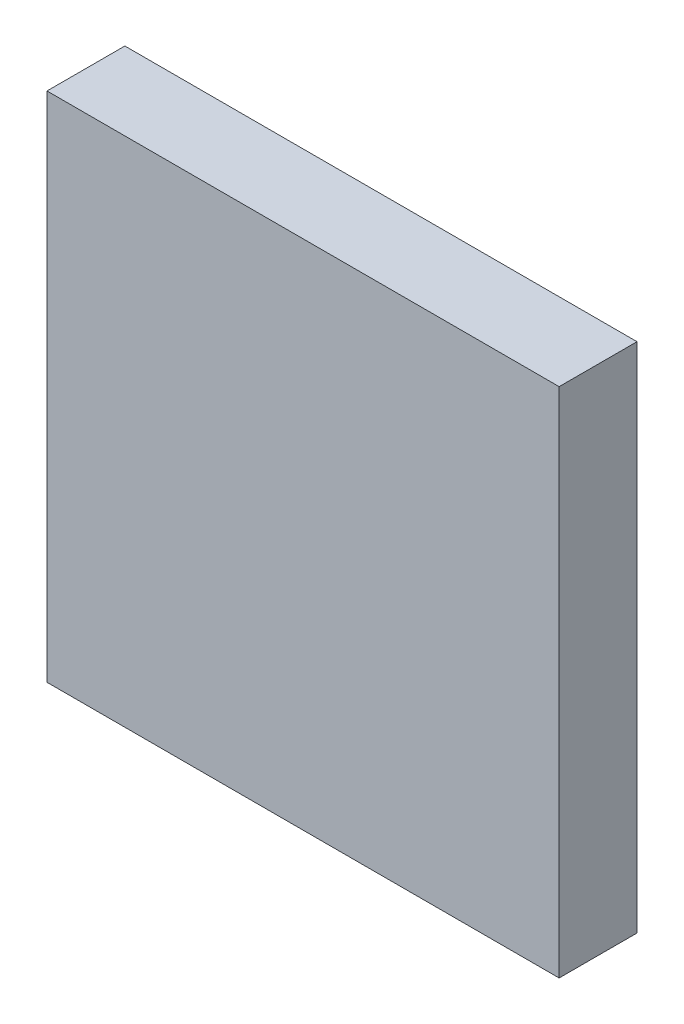
ISO-10303-21;
HEADER;
FILE_DESCRIPTION(('STEP AP214'),'2;1');
FILE_NAME('part.step','',(''),(''),'','','');
FILE_SCHEMA(('AUTOMOTIVE_DESIGN { 1 0 10303 214 1 1 1 1 }'));
ENDSEC;
DATA;
#1=APPLICATION_CONTEXT('core data for automotive mechanical design processes');
#2=APPLICATION_PROTOCOL_DEFINITION('international standard','automotive_design',2000,#1);
#3=PRODUCT_CONTEXT('',#1,'mechanical');
#4=PRODUCT('Part','Part','',(#3));
#5=PRODUCT_RELATED_PRODUCT_CATEGORY('part','',(#4));
#6=PRODUCT_DEFINITION_FORMATION('','',#4);
#7=PRODUCT_DEFINITION_CONTEXT('part definition',#1,'design');
#8=PRODUCT_DEFINITION('design','',#6,#7);
#9=PRODUCT_DEFINITION_SHAPE('','',#8);
#10=(LENGTH_UNIT() NAMED_UNIT(*) SI_UNIT(.MILLI.,.METRE.));
#11=(NAMED_UNIT(*) PLANE_ANGLE_UNIT() SI_UNIT($,.RADIAN.));
#12=(NAMED_UNIT(*) SI_UNIT($,.STERADIAN.) SOLID_ANGLE_UNIT());
#13=UNCERTAINTY_MEASURE_WITH_UNIT(LENGTH_MEASURE(1.E-05),#10,'distance_accuracy_value','');
#14=(GEOMETRIC_REPRESENTATION_CONTEXT(3) GLOBAL_UNCERTAINTY_ASSIGNED_CONTEXT((#13)) GLOBAL_UNIT_ASSIGNED_CONTEXT((#10,
#11,#12)) REPRESENTATION_CONTEXT('',''));
#15=CARTESIAN_POINT('',(0.,0.,0.));
#16=DIRECTION('',(0.,0.,1.));
#17=DIRECTION('',(1.,0.,0.));
#18=AXIS2_PLACEMENT_3D('',#15,#16,#17);
#19=CARTESIAN_POINT('',(7.0375,7.0375,2.14));
#20=DIRECTION('',(-1.,0.,0.));
#21=DIRECTION('',(0.,-1.,0.));
#22=AXIS2_PLACEMENT_3D('',#19,#20,#21);
#23=PLANE('',#22);
#24=DIRECTION('',(0.,1.,0.));
#25=VECTOR('',#24,1.);
#26=CARTESIAN_POINT('',(7.0375,7.0375,0.));
#27=LINE('',#26,#25);
#28=CARTESIAN_POINT('',(7.0375,-7.0375,0.));
#29=VERTEX_POINT('',#28);
#30=CARTESIAN_POINT('',(7.0375,7.0375,0.));
#31=VERTEX_POINT('',#30);
#32=EDGE_CURVE('E113',#29,#31,#27,.T.);
#33=ORIENTED_EDGE('',*,*,#32,.T.);
#34=DIRECTION('',(0.,0.,-1.));
#35=VECTOR('',#34,1.);
#36=CARTESIAN_POINT('',(7.0375,7.0375,2.14));
#37=LINE('',#36,#35);
#38=CARTESIAN_POINT('',(7.0375,7.0375,2.14));
#39=VERTEX_POINT('',#38);
#40=EDGE_CURVE('E11',#39,#31,#37,.T.);
#41=ORIENTED_EDGE('',*,*,#40,.F.);
#42=DIRECTION('',(0.,1.,0.));
#43=VECTOR('',#42,1.);
#44=CARTESIAN_POINT('',(7.0375,7.0375,2.14));
#45=LINE('',#44,#43);
#46=CARTESIAN_POINT('',(7.0375,-7.0375,2.14));
#47=VERTEX_POINT('',#46);
#48=EDGE_CURVE('E95',#47,#39,#45,.T.);
#49=ORIENTED_EDGE('',*,*,#48,.F.);
#50=DIRECTION('',(0.,0.,-1.));
#51=VECTOR('',#50,1.);
#52=CARTESIAN_POINT('',(7.0375,-7.0375,2.14));
#53=LINE('',#52,#51);
#54=EDGE_CURVE('E109',#47,#29,#53,.T.);
#55=ORIENTED_EDGE('',*,*,#54,.T.);
#56=EDGE_LOOP('',(#33,#41,#49,#55));
#57=FACE_BOUND('',#56,.T.);
#58=ADVANCED_FACE('F43',(#57),#23,.F.);
#59=CARTESIAN_POINT('',(-7.0375,7.0375,2.14));
#60=DIRECTION('',(0.,-1.,0.));
#61=DIRECTION('',(0.,0.,-1.));
#62=AXIS2_PLACEMENT_3D('',#59,#60,#61);
#63=PLANE('',#62);
#64=DIRECTION('',(-1.,0.,0.));
#65=VECTOR('',#64,1.);
#66=CARTESIAN_POINT('',(-7.0375,7.0375,0.));
#67=LINE('',#66,#65);
#68=CARTESIAN_POINT('',(-7.0375,7.0375,0.));
#69=VERTEX_POINT('',#68);
#70=EDGE_CURVE('E100',#31,#69,#67,.T.);
#71=ORIENTED_EDGE('',*,*,#70,.T.);
#72=DIRECTION('',(0.,0.,-1.));
#73=VECTOR('',#72,1.);
#74=CARTESIAN_POINT('',(-7.0375,7.0375,2.14));
#75=LINE('',#74,#73);
#76=CARTESIAN_POINT('',(-7.0375,7.0375,2.14));
#77=VERTEX_POINT('',#76);
#78=EDGE_CURVE('E52',#77,#69,#75,.T.);
#79=ORIENTED_EDGE('',*,*,#78,.F.);
#80=DIRECTION('',(-1.,0.,0.));
#81=VECTOR('',#80,1.);
#82=CARTESIAN_POINT('',(-7.0375,7.0375,2.14));
#83=LINE('',#82,#81);
#84=EDGE_CURVE('E90',#39,#77,#83,.T.);
#85=ORIENTED_EDGE('',*,*,#84,.F.);
#86=ORIENTED_EDGE('',*,*,#40,.T.);
#87=EDGE_LOOP('',(#71,#79,#85,#86));
#88=FACE_BOUND('',#87,.T.);
#89=ADVANCED_FACE('F99',(#88),#63,.F.);
#90=CARTESIAN_POINT('',(-7.0375,7.0375,2.14));
#91=DIRECTION('',(1.,0.,0.));
#92=DIRECTION('',(0.,1.,0.));
#93=AXIS2_PLACEMENT_3D('',#90,#91,#92);
#94=PLANE('',#93);
#95=DIRECTION('',(0.,-1.,0.));
#96=VECTOR('',#95,1.);
#97=CARTESIAN_POINT('',(-7.0375,7.0375,0.));
#98=LINE('',#97,#96);
#99=CARTESIAN_POINT('',(-7.0375,-7.0375,0.));
#100=VERTEX_POINT('',#99);
#101=EDGE_CURVE('E77',#69,#100,#98,.T.);
#102=ORIENTED_EDGE('',*,*,#101,.T.);
#103=DIRECTION('',(0.,0.,-1.));
#104=VECTOR('',#103,1.);
#105=CARTESIAN_POINT('',(-7.0375,-7.0375,2.14));
#106=LINE('',#105,#104);
#107=CARTESIAN_POINT('',(-7.0375,-7.0375,2.14));
#108=VERTEX_POINT('',#107);
#109=EDGE_CURVE('E102',#108,#100,#106,.T.);
#110=ORIENTED_EDGE('',*,*,#109,.F.);
#111=DIRECTION('',(0.,-1.,0.));
#112=VECTOR('',#111,1.);
#113=CARTESIAN_POINT('',(-7.0375,7.0375,2.14));
#114=LINE('',#113,#112);
#115=EDGE_CURVE('E93',#77,#108,#114,.T.);
#116=ORIENTED_EDGE('',*,*,#115,.F.);
#117=ORIENTED_EDGE('',*,*,#78,.T.);
#118=EDGE_LOOP('',(#102,#110,#116,#117));
#119=FACE_BOUND('',#118,.T.);
#120=ADVANCED_FACE('F103',(#119),#94,.F.);
#121=CARTESIAN_POINT('',(-7.0375,-7.0375,2.14));
#122=DIRECTION('',(0.,1.,0.));
#123=DIRECTION('',(0.,0.,1.));
#124=AXIS2_PLACEMENT_3D('',#121,#122,#123);
#125=PLANE('',#124);
#126=DIRECTION('',(1.,0.,0.));
#127=VECTOR('',#126,1.);
#128=CARTESIAN_POINT('',(-7.0375,-7.0375,0.));
#129=LINE('',#128,#127);
#130=EDGE_CURVE('E83',#100,#29,#129,.T.);
#131=ORIENTED_EDGE('',*,*,#130,.T.);
#132=ORIENTED_EDGE('',*,*,#54,.F.);
#133=DIRECTION('',(1.,0.,0.));
#134=VECTOR('',#133,1.);
#135=CARTESIAN_POINT('',(-7.0375,-7.0375,2.14));
#136=LINE('',#135,#134);
#137=EDGE_CURVE('E60',#108,#47,#136,.T.);
#138=ORIENTED_EDGE('',*,*,#137,.F.);
#139=ORIENTED_EDGE('',*,*,#109,.T.);
#140=EDGE_LOOP('',(#131,#132,#138,#139));
#141=FACE_BOUND('',#140,.T.);
#142=ADVANCED_FACE('F124',(#141),#125,.F.);
#143=CARTESIAN_POINT('',(0.,0.,2.14));
#144=DIRECTION('',(0.,0.,1.));
#145=DIRECTION('',(1.,0.,0.));
#146=AXIS2_PLACEMENT_3D('',#143,#144,#145);
#147=PLANE('',#146);
#148=ORIENTED_EDGE('',*,*,#48,.T.);
#149=ORIENTED_EDGE('',*,*,#84,.T.);
#150=ORIENTED_EDGE('',*,*,#115,.T.);
#151=ORIENTED_EDGE('',*,*,#137,.T.);
#152=EDGE_LOOP('',(#148,#149,#150,#151));
#153=FACE_BOUND('',#152,.T.);
#154=ADVANCED_FACE('F91',(#153),#147,.T.);
#155=CARTESIAN_POINT('',(0.,0.,0.));
#156=DIRECTION('',(0.,0.,1.));
#157=DIRECTION('',(1.,0.,0.));
#158=AXIS2_PLACEMENT_3D('',#155,#156,#157);
#159=PLANE('',#158);
#160=ORIENTED_EDGE('',*,*,#32,.F.);
#161=ORIENTED_EDGE('',*,*,#130,.F.);
#162=ORIENTED_EDGE('',*,*,#101,.F.);
#163=ORIENTED_EDGE('',*,*,#70,.F.);
#164=EDGE_LOOP('',(#160,#161,#162,#163));
#165=FACE_BOUND('',#164,.T.);
#166=ADVANCED_FACE('F127',(#165),#159,.F.);
#167=CLOSED_SHELL('',(#58,#89,#120,#142,#154,#166));
#168=MANIFOLD_SOLID_BREP('B2',#167);
#169=ADVANCED_BREP_SHAPE_REPRESENTATION('',(#18,#168),#14);
#170=SHAPE_DEFINITION_REPRESENTATION(#9,#169);
ENDSEC;
END-ISO-10303-21;
